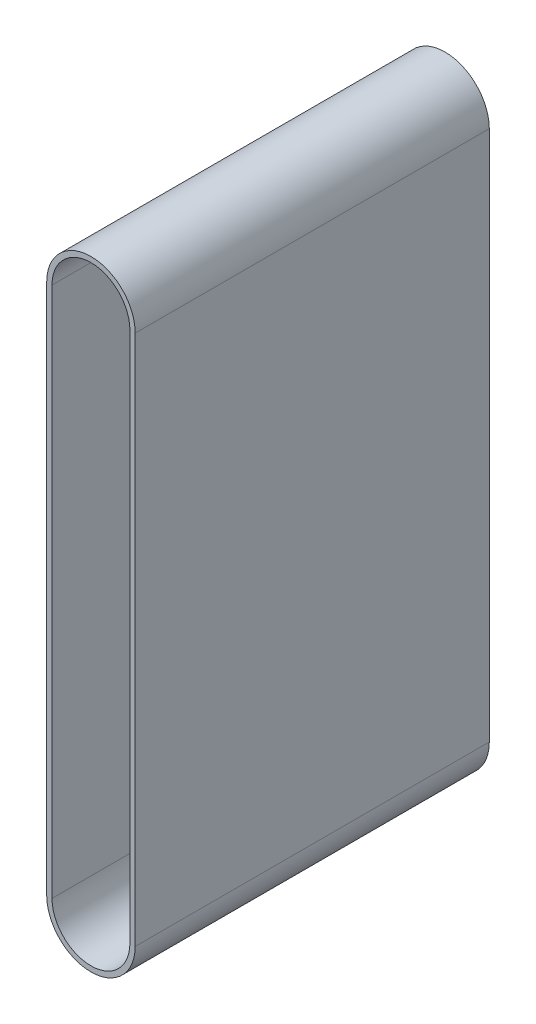
ISO-10303-21;
HEADER;
FILE_DESCRIPTION(('STEP AP214'),'2;1');
FILE_NAME('part.step','',(''),(''),'','','');
FILE_SCHEMA(('AUTOMOTIVE_DESIGN { 1 0 10303 214 1 1 1 1 }'));
ENDSEC;
DATA;
#1=APPLICATION_CONTEXT('core data for automotive mechanical design processes');
#2=APPLICATION_PROTOCOL_DEFINITION('international standard','automotive_design',2000,#1);
#3=PRODUCT_CONTEXT('',#1,'mechanical');
#4=PRODUCT('Part','Part','',(#3));
#5=PRODUCT_RELATED_PRODUCT_CATEGORY('part','',(#4));
#6=PRODUCT_DEFINITION_FORMATION('','',#4);
#7=PRODUCT_DEFINITION_CONTEXT('part definition',#1,'design');
#8=PRODUCT_DEFINITION('design','',#6,#7);
#9=PRODUCT_DEFINITION_SHAPE('','',#8);
#10=(LENGTH_UNIT() NAMED_UNIT(*) SI_UNIT(.MILLI.,.METRE.));
#11=(NAMED_UNIT(*) PLANE_ANGLE_UNIT() SI_UNIT($,.RADIAN.));
#12=(NAMED_UNIT(*) SI_UNIT($,.STERADIAN.) SOLID_ANGLE_UNIT());
#13=UNCERTAINTY_MEASURE_WITH_UNIT(LENGTH_MEASURE(1.E-05),#10,'distance_accuracy_value','');
#14=(GEOMETRIC_REPRESENTATION_CONTEXT(3) GLOBAL_UNCERTAINTY_ASSIGNED_CONTEXT((#13)) GLOBAL_UNIT_ASSIGNED_CONTEXT((#10,
#11,#12)) REPRESENTATION_CONTEXT('',''));
#15=CARTESIAN_POINT('',(0.,0.,0.));
#16=DIRECTION('',(0.,0.,1.));
#17=DIRECTION('',(1.,0.,0.));
#18=AXIS2_PLACEMENT_3D('',#15,#16,#17);
#19=CARTESIAN_POINT('',(0.,0.,200.));
#20=DIRECTION('',(0.,0.,-1.));
#21=DIRECTION('',(-1.,0.,0.));
#22=AXIS2_PLACEMENT_3D('',#19,#20,#21);
#23=CYLINDRICAL_SURFACE('',#22,25.);
#24=CARTESIAN_POINT('',(0.,0.,0.));
#25=DIRECTION('',(0.,0.,1.));
#26=DIRECTION('',(1.,0.,0.));
#27=AXIS2_PLACEMENT_3D('',#24,#25,#26);
#28=CIRCLE('',#27,25.);
#29=CARTESIAN_POINT('',(-25.,0.,0.));
#30=VERTEX_POINT('',#29);
#31=CARTESIAN_POINT('',(25.,0.,0.));
#32=VERTEX_POINT('',#31);
#33=EDGE_CURVE('E130',#30,#32,#28,.T.);
#34=ORIENTED_EDGE('',*,*,#33,.T.);
#35=DIRECTION('',(0.,0.,-1.));
#36=VECTOR('',#35,1.);
#37=CARTESIAN_POINT('',(25.,0.,200.));
#38=LINE('',#37,#36);
#39=CARTESIAN_POINT('',(25.,0.,200.));
#40=VERTEX_POINT('',#39);
#41=EDGE_CURVE('E11',#40,#32,#38,.T.);
#42=ORIENTED_EDGE('',*,*,#41,.F.);
#43=CARTESIAN_POINT('',(0.,0.,200.));
#44=DIRECTION('',(0.,0.,1.));
#45=DIRECTION('',(1.,0.,0.));
#46=AXIS2_PLACEMENT_3D('',#43,#44,#45);
#47=CIRCLE('',#46,25.);
#48=CARTESIAN_POINT('',(-25.,0.,200.));
#49=VERTEX_POINT('',#48);
#50=EDGE_CURVE('E134',#49,#40,#47,.T.);
#51=ORIENTED_EDGE('',*,*,#50,.F.);
#52=DIRECTION('',(0.,0.,-1.));
#53=VECTOR('',#52,1.);
#54=CARTESIAN_POINT('',(-25.,0.,200.));
#55=LINE('',#54,#53);
#56=EDGE_CURVE('E144',#49,#30,#55,.T.);
#57=ORIENTED_EDGE('',*,*,#56,.T.);
#58=EDGE_LOOP('',(#34,#42,#51,#57));
#59=FACE_BOUND('',#58,.T.);
#60=ADVANCED_FACE('F33',(#59),#23,.T.);
#61=CARTESIAN_POINT('',(25.,0.,200.));
#62=DIRECTION('',(-1.,0.,0.));
#63=DIRECTION('',(0.,0.,1.));
#64=AXIS2_PLACEMENT_3D('',#61,#62,#63);
#65=PLANE('',#64);
#66=DIRECTION('',(0.,1.,0.));
#67=VECTOR('',#66,1.);
#68=CARTESIAN_POINT('',(25.,0.,0.));
#69=LINE('',#68,#67);
#70=CARTESIAN_POINT('',(25.,300.,0.));
#71=VERTEX_POINT('',#70);
#72=EDGE_CURVE('E147',#32,#71,#69,.T.);
#73=ORIENTED_EDGE('',*,*,#72,.T.);
#74=DIRECTION('',(0.,0.,-1.));
#75=VECTOR('',#74,1.);
#76=CARTESIAN_POINT('',(25.,300.,200.));
#77=LINE('',#76,#75);
#78=CARTESIAN_POINT('',(25.,300.,200.));
#79=VERTEX_POINT('',#78);
#80=EDGE_CURVE('E40',#79,#71,#77,.T.);
#81=ORIENTED_EDGE('',*,*,#80,.F.);
#82=DIRECTION('',(0.,1.,0.));
#83=VECTOR('',#82,1.);
#84=CARTESIAN_POINT('',(25.,0.,200.));
#85=LINE('',#84,#83);
#86=EDGE_CURVE('E137',#40,#79,#85,.T.);
#87=ORIENTED_EDGE('',*,*,#86,.F.);
#88=ORIENTED_EDGE('',*,*,#41,.T.);
#89=EDGE_LOOP('',(#73,#81,#87,#88));
#90=FACE_BOUND('',#89,.T.);
#91=ADVANCED_FACE('F175',(#90),#65,.F.);
#92=CARTESIAN_POINT('',(0.,300.,200.));
#93=DIRECTION('',(0.,0.,-1.));
#94=DIRECTION('',(-1.,0.,0.));
#95=AXIS2_PLACEMENT_3D('',#92,#93,#94);
#96=CYLINDRICAL_SURFACE('',#95,25.);
#97=CARTESIAN_POINT('',(0.,300.,0.));
#98=DIRECTION('',(0.,0.,1.));
#99=DIRECTION('',(1.,0.,0.));
#100=AXIS2_PLACEMENT_3D('',#97,#98,#99);
#101=CIRCLE('',#100,25.);
#102=CARTESIAN_POINT('',(-25.,300.,0.));
#103=VERTEX_POINT('',#102);
#104=EDGE_CURVE('E149',#71,#103,#101,.T.);
#105=ORIENTED_EDGE('',*,*,#104,.T.);
#106=DIRECTION('',(0.,0.,-1.));
#107=VECTOR('',#106,1.);
#108=CARTESIAN_POINT('',(-25.,300.,200.));
#109=LINE('',#108,#107);
#110=CARTESIAN_POINT('',(-25.,300.,200.));
#111=VERTEX_POINT('',#110);
#112=EDGE_CURVE('E154',#111,#103,#109,.T.);
#113=ORIENTED_EDGE('',*,*,#112,.F.);
#114=CARTESIAN_POINT('',(0.,300.,200.));
#115=DIRECTION('',(0.,0.,1.));
#116=DIRECTION('',(1.,0.,0.));
#117=AXIS2_PLACEMENT_3D('',#114,#115,#116);
#118=CIRCLE('',#117,25.);
#119=EDGE_CURVE('E140',#79,#111,#118,.T.);
#120=ORIENTED_EDGE('',*,*,#119,.F.);
#121=ORIENTED_EDGE('',*,*,#80,.T.);
#122=EDGE_LOOP('',(#105,#113,#120,#121));
#123=FACE_BOUND('',#122,.T.);
#124=ADVANCED_FACE('F161',(#123),#96,.T.);
#125=CARTESIAN_POINT('',(-25.,0.,200.));
#126=DIRECTION('',(1.,0.,0.));
#127=DIRECTION('',(0.,0.,-1.));
#128=AXIS2_PLACEMENT_3D('',#125,#126,#127);
#129=PLANE('',#128);
#130=DIRECTION('',(0.,-1.,0.));
#131=VECTOR('',#130,1.);
#132=CARTESIAN_POINT('',(-25.,0.,0.));
#133=LINE('',#132,#131);
#134=EDGE_CURVE('E138',#103,#30,#133,.T.);
#135=ORIENTED_EDGE('',*,*,#134,.T.);
#136=ORIENTED_EDGE('',*,*,#56,.F.);
#137=DIRECTION('',(0.,-1.,0.));
#138=VECTOR('',#137,1.);
#139=CARTESIAN_POINT('',(-25.,0.,200.));
#140=LINE('',#139,#138);
#141=EDGE_CURVE('E142',#111,#49,#140,.T.);
#142=ORIENTED_EDGE('',*,*,#141,.F.);
#143=ORIENTED_EDGE('',*,*,#112,.T.);
#144=EDGE_LOOP('',(#135,#136,#142,#143));
#145=FACE_BOUND('',#144,.T.);
#146=ADVANCED_FACE('F168',(#145),#129,.F.);
#147=CARTESIAN_POINT('',(0.,0.,200.));
#148=DIRECTION('',(0.,0.,1.));
#149=DIRECTION('',(1.,0.,0.));
#150=AXIS2_PLACEMENT_3D('',#147,#148,#149);
#151=PLANE('',#150);
#152=CARTESIAN_POINT('',(0.,300.,200.));
#153=DIRECTION('',(0.,0.,1.));
#154=DIRECTION('',(1.,0.,0.));
#155=AXIS2_PLACEMENT_3D('',#152,#153,#154);
#156=CIRCLE('',#155,22.);
#157=CARTESIAN_POINT('',(22.0000000000001,300.,200.));
#158=VERTEX_POINT('',#157);
#159=CARTESIAN_POINT('',(-22.,300.,200.));
#160=VERTEX_POINT('',#159);
#161=EDGE_CURVE('E47',#158,#160,#156,.T.);
#162=ORIENTED_EDGE('',*,*,#161,.F.);
#163=DIRECTION('',(0.,1.,0.));
#164=VECTOR('',#163,1.);
#165=CARTESIAN_POINT('',(22.0000000000001,300.,200.));
#166=LINE('',#165,#164);
#167=CARTESIAN_POINT('',(22.0000000000002,0.,200.));
#168=VERTEX_POINT('',#167);
#169=EDGE_CURVE('E115',#168,#158,#166,.T.);
#170=ORIENTED_EDGE('',*,*,#169,.F.);
#171=CARTESIAN_POINT('',(0.,0.,200.));
#172=DIRECTION('',(0.,0.,1.));
#173=DIRECTION('',(1.,0.,0.));
#174=AXIS2_PLACEMENT_3D('',#171,#172,#173);
#175=CIRCLE('',#174,22.0000000000001);
#176=CARTESIAN_POINT('',(-22.0000000000001,0.,200.));
#177=VERTEX_POINT('',#176);
#178=EDGE_CURVE('E118',#177,#168,#175,.T.);
#179=ORIENTED_EDGE('',*,*,#178,.F.);
#180=DIRECTION('',(0.,-1.,0.));
#181=VECTOR('',#180,1.);
#182=CARTESIAN_POINT('',(-22.,300.,200.));
#183=LINE('',#182,#181);
#184=EDGE_CURVE('E124',#160,#177,#183,.T.);
#185=ORIENTED_EDGE('',*,*,#184,.F.);
#186=EDGE_LOOP('',(#162,#170,#179,#185));
#187=FACE_BOUND('',#186,.T.);
#188=ORIENTED_EDGE('',*,*,#50,.T.);
#189=ORIENTED_EDGE('',*,*,#86,.T.);
#190=ORIENTED_EDGE('',*,*,#119,.T.);
#191=ORIENTED_EDGE('',*,*,#141,.T.);
#192=EDGE_LOOP('',(#188,#189,#190,#191));
#193=FACE_BOUND('',#192,.T.);
#194=ADVANCED_FACE('F174',(#187,#193),#151,.T.);
#195=CARTESIAN_POINT('',(0.,0.,0.));
#196=DIRECTION('',(0.,0.,1.));
#197=DIRECTION('',(1.,0.,0.));
#198=AXIS2_PLACEMENT_3D('',#195,#196,#197);
#199=PLANE('',#198);
#200=DIRECTION('',(0.,1.,0.));
#201=VECTOR('',#200,1.);
#202=CARTESIAN_POINT('',(22.0000000000001,300.,0.));
#203=LINE('',#202,#201);
#204=CARTESIAN_POINT('',(22.0000000000002,0.,0.));
#205=VERTEX_POINT('',#204);
#206=CARTESIAN_POINT('',(22.0000000000001,300.,0.));
#207=VERTEX_POINT('',#206);
#208=EDGE_CURVE('E105',#205,#207,#203,.T.);
#209=ORIENTED_EDGE('',*,*,#208,.T.);
#210=CARTESIAN_POINT('',(0.,300.,0.));
#211=DIRECTION('',(0.,0.,1.));
#212=DIRECTION('',(1.,0.,0.));
#213=AXIS2_PLACEMENT_3D('',#210,#211,#212);
#214=CIRCLE('',#213,22.);
#215=CARTESIAN_POINT('',(-22.,300.,0.));
#216=VERTEX_POINT('',#215);
#217=EDGE_CURVE('E99',#207,#216,#214,.T.);
#218=ORIENTED_EDGE('',*,*,#217,.T.);
#219=DIRECTION('',(0.,-1.,0.));
#220=VECTOR('',#219,1.);
#221=CARTESIAN_POINT('',(-22.,300.,0.));
#222=LINE('',#221,#220);
#223=CARTESIAN_POINT('',(-22.,0.,0.));
#224=VERTEX_POINT('',#223);
#225=EDGE_CURVE('E108',#216,#224,#222,.T.);
#226=ORIENTED_EDGE('',*,*,#225,.T.);
#227=CARTESIAN_POINT('',(0.,0.,0.));
#228=DIRECTION('',(0.,0.,1.));
#229=DIRECTION('',(1.,0.,0.));
#230=AXIS2_PLACEMENT_3D('',#227,#228,#229);
#231=CIRCLE('',#230,22.0000000000001);
#232=EDGE_CURVE('E55',#224,#205,#231,.T.);
#233=ORIENTED_EDGE('',*,*,#232,.T.);
#234=EDGE_LOOP('',(#209,#218,#226,#233));
#235=FACE_BOUND('',#234,.T.);
#236=ORIENTED_EDGE('',*,*,#33,.F.);
#237=ORIENTED_EDGE('',*,*,#134,.F.);
#238=ORIENTED_EDGE('',*,*,#104,.F.);
#239=ORIENTED_EDGE('',*,*,#72,.F.);
#240=EDGE_LOOP('',(#236,#237,#238,#239));
#241=FACE_BOUND('',#240,.T.);
#242=ADVANCED_FACE('F112',(#235,#241),#199,.F.);
#243=CARTESIAN_POINT('',(0.,300.,0.));
#244=DIRECTION('',(0.,0.,1.));
#245=DIRECTION('',(1.,0.,0.));
#246=AXIS2_PLACEMENT_3D('',#243,#244,#245);
#247=CYLINDRICAL_SURFACE('',#246,22.);
#248=ORIENTED_EDGE('',*,*,#161,.T.);
#249=DIRECTION('',(0.,0.,1.));
#250=VECTOR('',#249,1.);
#251=CARTESIAN_POINT('',(-22.,300.,0.));
#252=LINE('',#251,#250);
#253=EDGE_CURVE('E95',#216,#160,#252,.T.);
#254=ORIENTED_EDGE('',*,*,#253,.F.);
#255=ORIENTED_EDGE('',*,*,#217,.F.);
#256=DIRECTION('',(0.,0.,1.));
#257=VECTOR('',#256,1.);
#258=CARTESIAN_POINT('',(22.0000000000001,300.,0.));
#259=LINE('',#258,#257);
#260=EDGE_CURVE('E128',#207,#158,#259,.T.);
#261=ORIENTED_EDGE('',*,*,#260,.T.);
#262=EDGE_LOOP('',(#248,#254,#255,#261));
#263=FACE_BOUND('',#262,.T.);
#264=ADVANCED_FACE('F97',(#263),#247,.F.);
#265=CARTESIAN_POINT('',(22.0000000000001,300.,0.));
#266=DIRECTION('',(1.,0.,0.));
#267=DIRECTION('',(0.,1.,0.));
#268=AXIS2_PLACEMENT_3D('',#265,#266,#267);
#269=PLANE('',#268);
#270=ORIENTED_EDGE('',*,*,#169,.T.);
#271=ORIENTED_EDGE('',*,*,#260,.F.);
#272=ORIENTED_EDGE('',*,*,#208,.F.);
#273=DIRECTION('',(0.,0.,1.));
#274=VECTOR('',#273,1.);
#275=CARTESIAN_POINT('',(22.0000000000002,0.,0.));
#276=LINE('',#275,#274);
#277=EDGE_CURVE('E131',#205,#168,#276,.T.);
#278=ORIENTED_EDGE('',*,*,#277,.T.);
#279=EDGE_LOOP('',(#270,#271,#272,#278));
#280=FACE_BOUND('',#279,.T.);
#281=ADVANCED_FACE('F192',(#280),#269,.F.);
#282=CARTESIAN_POINT('',(0.,0.,0.));
#283=DIRECTION('',(0.,0.,1.));
#284=DIRECTION('',(1.,0.,0.));
#285=AXIS2_PLACEMENT_3D('',#282,#283,#284);
#286=CYLINDRICAL_SURFACE('',#285,22.0000000000001);
#287=ORIENTED_EDGE('',*,*,#178,.T.);
#288=ORIENTED_EDGE('',*,*,#277,.F.);
#289=ORIENTED_EDGE('',*,*,#232,.F.);
#290=DIRECTION('',(0.,0.,1.));
#291=VECTOR('',#290,1.);
#292=CARTESIAN_POINT('',(-22.0000000000001,0.,0.));
#293=LINE('',#292,#291);
#294=EDGE_CURVE('E104',#224,#177,#293,.T.);
#295=ORIENTED_EDGE('',*,*,#294,.T.);
#296=EDGE_LOOP('',(#287,#288,#289,#295));
#297=FACE_BOUND('',#296,.T.);
#298=ADVANCED_FACE('F195',(#297),#286,.F.);
#299=CARTESIAN_POINT('',(-22.,300.,0.));
#300=DIRECTION('',(-1.,0.,0.));
#301=DIRECTION('',(0.,-1.,0.));
#302=AXIS2_PLACEMENT_3D('',#299,#300,#301);
#303=PLANE('',#302);
#304=ORIENTED_EDGE('',*,*,#184,.T.);
#305=ORIENTED_EDGE('',*,*,#294,.F.);
#306=ORIENTED_EDGE('',*,*,#225,.F.);
#307=ORIENTED_EDGE('',*,*,#253,.T.);
#308=EDGE_LOOP('',(#304,#305,#306,#307));
#309=FACE_BOUND('',#308,.T.);
#310=ADVANCED_FACE('F109',(#309),#303,.F.);
#311=CLOSED_SHELL('',(#60,#91,#124,#146,#194,#242,#264,#281,#298,#310));
#312=MANIFOLD_SOLID_BREP('B2',#311);
#313=ADVANCED_BREP_SHAPE_REPRESENTATION('',(#18,#312),#14);
#314=SHAPE_DEFINITION_REPRESENTATION(#9,#313);
ENDSEC;
END-ISO-10303-21;
